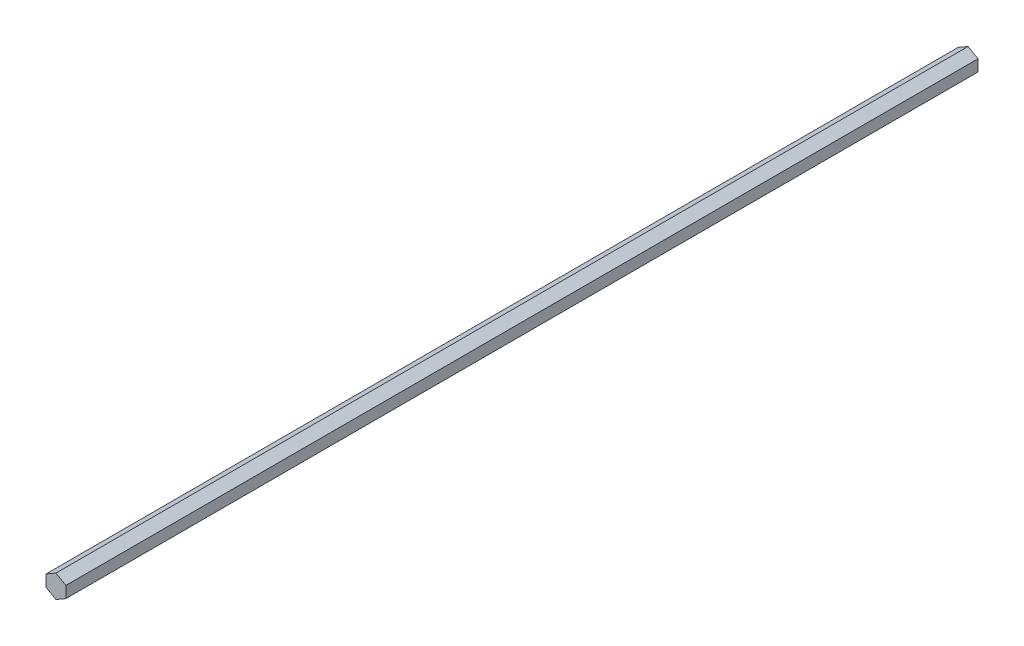
ISO-10303-21;
HEADER;
FILE_DESCRIPTION(('STEP AP214'),'2;1');
FILE_NAME('part.step','',(''),(''),'','','');
FILE_SCHEMA(('AUTOMOTIVE_DESIGN { 1 0 10303 214 1 1 1 1 }'));
ENDSEC;
DATA;
#1=APPLICATION_CONTEXT('core data for automotive mechanical design processes');
#2=APPLICATION_PROTOCOL_DEFINITION('international standard','automotive_design',2000,#1);
#3=PRODUCT_CONTEXT('',#1,'mechanical');
#4=PRODUCT('Part','Part','',(#3));
#5=PRODUCT_RELATED_PRODUCT_CATEGORY('part','',(#4));
#6=PRODUCT_DEFINITION_FORMATION('','',#4);
#7=PRODUCT_DEFINITION_CONTEXT('part definition',#1,'design');
#8=PRODUCT_DEFINITION('design','',#6,#7);
#9=PRODUCT_DEFINITION_SHAPE('','',#8);
#10=(LENGTH_UNIT() NAMED_UNIT(*) SI_UNIT(.MILLI.,.METRE.));
#11=(NAMED_UNIT(*) PLANE_ANGLE_UNIT() SI_UNIT($,.RADIAN.));
#12=(NAMED_UNIT(*) SI_UNIT($,.STERADIAN.) SOLID_ANGLE_UNIT());
#13=UNCERTAINTY_MEASURE_WITH_UNIT(LENGTH_MEASURE(1.E-05),#10,'distance_accuracy_value','');
#14=(GEOMETRIC_REPRESENTATION_CONTEXT(3) GLOBAL_UNCERTAINTY_ASSIGNED_CONTEXT((#13)) GLOBAL_UNIT_ASSIGNED_CONTEXT((#10,
#11,#12)) REPRESENTATION_CONTEXT('',''));
#15=CARTESIAN_POINT('',(0.,0.,0.));
#16=DIRECTION('',(0.,0.,1.));
#17=DIRECTION('',(1.,0.,0.));
#18=AXIS2_PLACEMENT_3D('',#15,#16,#17);
#19=CARTESIAN_POINT('',(6.35,-3.66617420935412,292.1));
#20=DIRECTION('',(-1.,0.,0.));
#21=DIRECTION('',(0.,-1.,0.));
#22=AXIS2_PLACEMENT_3D('',#19,#20,#21);
#23=PLANE('',#22);
#24=DIRECTION('',(0.,1.,0.));
#25=VECTOR('',#24,1.);
#26=CARTESIAN_POINT('',(6.35,-3.66617420935412,-292.1));
#27=LINE('',#26,#25);
#28=CARTESIAN_POINT('',(6.35,-3.66617420935412,-292.1));
#29=VERTEX_POINT('',#28);
#30=CARTESIAN_POINT('',(6.35,3.66617420935412,-292.1));
#31=VERTEX_POINT('',#30);
#32=EDGE_CURVE('E120',#29,#31,#27,.T.);
#33=ORIENTED_EDGE('',*,*,#32,.T.);
#34=DIRECTION('',(0.,0.,-1.));
#35=VECTOR('',#34,1.);
#36=CARTESIAN_POINT('',(6.35,3.66617420935412,292.1));
#37=LINE('',#36,#35);
#38=CARTESIAN_POINT('',(6.35,3.66617420935412,292.1));
#39=VERTEX_POINT('',#38);
#40=EDGE_CURVE('E11',#39,#31,#37,.T.);
#41=ORIENTED_EDGE('',*,*,#40,.F.);
#42=DIRECTION('',(0.,1.,0.));
#43=VECTOR('',#42,1.);
#44=CARTESIAN_POINT('',(6.35,-3.66617420935412,292.1));
#45=LINE('',#44,#43);
#46=CARTESIAN_POINT('',(6.35,-3.66617420935412,292.1));
#47=VERTEX_POINT('',#46);
#48=EDGE_CURVE('E130',#47,#39,#45,.T.);
#49=ORIENTED_EDGE('',*,*,#48,.F.);
#50=DIRECTION('',(0.,0.,-1.));
#51=VECTOR('',#50,1.);
#52=CARTESIAN_POINT('',(6.35,-3.66617420935412,292.1));
#53=LINE('',#52,#51);
#54=EDGE_CURVE('E116',#47,#29,#53,.T.);
#55=ORIENTED_EDGE('',*,*,#54,.T.);
#56=EDGE_LOOP('',(#33,#41,#49,#55));
#57=FACE_BOUND('',#56,.T.);
#58=ADVANCED_FACE('F36',(#57),#23,.F.);
#59=CARTESIAN_POINT('',(6.35,3.66617420935412,292.1));
#60=DIRECTION('',(-0.5,-0.866025403784439,0.));
#61=DIRECTION('',(0.866025403784439,-0.5,0.));
#62=AXIS2_PLACEMENT_3D('',#59,#60,#61);
#63=PLANE('',#62);
#64=DIRECTION('',(-0.866025403784439,0.5,0.));
#65=VECTOR('',#64,1.);
#66=CARTESIAN_POINT('',(6.35,3.66617420935412,-292.1));
#67=LINE('',#66,#65);
#68=CARTESIAN_POINT('',(0.,7.33234841870825,-292.1));
#69=VERTEX_POINT('',#68);
#70=EDGE_CURVE('E123',#31,#69,#67,.T.);
#71=ORIENTED_EDGE('',*,*,#70,.T.);
#72=DIRECTION('',(0.,0.,-1.));
#73=VECTOR('',#72,1.);
#74=CARTESIAN_POINT('',(0.,7.33234841870825,292.1));
#75=LINE('',#74,#73);
#76=CARTESIAN_POINT('',(0.,7.33234841870825,292.1));
#77=VERTEX_POINT('',#76);
#78=EDGE_CURVE('E44',#77,#69,#75,.T.);
#79=ORIENTED_EDGE('',*,*,#78,.F.);
#80=DIRECTION('',(-0.866025403784439,0.5,0.));
#81=VECTOR('',#80,1.);
#82=CARTESIAN_POINT('',(6.35,3.66617420935412,292.1));
#83=LINE('',#82,#81);
#84=EDGE_CURVE('E89',#39,#77,#83,.T.);
#85=ORIENTED_EDGE('',*,*,#84,.F.);
#86=ORIENTED_EDGE('',*,*,#40,.T.);
#87=EDGE_LOOP('',(#71,#79,#85,#86));
#88=FACE_BOUND('',#87,.T.);
#89=ADVANCED_FACE('F154',(#88),#63,.F.);
#90=CARTESIAN_POINT('',(0.,7.33234841870825,292.1));
#91=DIRECTION('',(0.5,-0.866025403784439,0.));
#92=DIRECTION('',(0.866025403784439,0.5,0.));
#93=AXIS2_PLACEMENT_3D('',#90,#91,#92);
#94=PLANE('',#93);
#95=DIRECTION('',(-0.866025403784439,-0.5,0.));
#96=VECTOR('',#95,1.);
#97=CARTESIAN_POINT('',(0.,7.33234841870825,-292.1));
#98=LINE('',#97,#96);
#99=CARTESIAN_POINT('',(-6.35,3.66617420935412,-292.1));
#100=VERTEX_POINT('',#99);
#101=EDGE_CURVE('E125',#69,#100,#98,.T.);
#102=ORIENTED_EDGE('',*,*,#101,.T.);
#103=DIRECTION('',(0.,0.,-1.));
#104=VECTOR('',#103,1.);
#105=CARTESIAN_POINT('',(-6.35,3.66617420935412,292.1));
#106=LINE('',#105,#104);
#107=CARTESIAN_POINT('',(-6.35,3.66617420935412,292.1));
#108=VERTEX_POINT('',#107);
#109=EDGE_CURVE('E111',#108,#100,#106,.T.);
#110=ORIENTED_EDGE('',*,*,#109,.F.);
#111=DIRECTION('',(-0.866025403784439,-0.5,0.));
#112=VECTOR('',#111,1.);
#113=CARTESIAN_POINT('',(0.,7.33234841870825,292.1));
#114=LINE('',#113,#112);
#115=EDGE_CURVE('E102',#77,#108,#114,.T.);
#116=ORIENTED_EDGE('',*,*,#115,.F.);
#117=ORIENTED_EDGE('',*,*,#78,.T.);
#118=EDGE_LOOP('',(#102,#110,#116,#117));
#119=FACE_BOUND('',#118,.T.);
#120=ADVANCED_FACE('F136',(#119),#94,.F.);
#121=CARTESIAN_POINT('',(-6.35,3.66617420935412,292.1));
#122=DIRECTION('',(1.,0.,0.));
#123=DIRECTION('',(0.,1.,0.));
#124=AXIS2_PLACEMENT_3D('',#121,#122,#123);
#125=PLANE('',#124);
#126=DIRECTION('',(0.,-1.,0.));
#127=VECTOR('',#126,1.);
#128=CARTESIAN_POINT('',(-6.35,3.66617420935412,-292.1));
#129=LINE('',#128,#127);
#130=CARTESIAN_POINT('',(-6.35,-3.66617420935412,-292.1));
#131=VERTEX_POINT('',#130);
#132=EDGE_CURVE('E110',#100,#131,#129,.T.);
#133=ORIENTED_EDGE('',*,*,#132,.T.);
#134=DIRECTION('',(0.,0.,-1.));
#135=VECTOR('',#134,1.);
#136=CARTESIAN_POINT('',(-6.35,-3.66617420935412,292.1));
#137=LINE('',#136,#135);
#138=CARTESIAN_POINT('',(-6.35,-3.66617420935412,292.1));
#139=VERTEX_POINT('',#138);
#140=EDGE_CURVE('E107',#139,#131,#137,.T.);
#141=ORIENTED_EDGE('',*,*,#140,.F.);
#142=DIRECTION('',(0.,-1.,0.));
#143=VECTOR('',#142,1.);
#144=CARTESIAN_POINT('',(-6.35,3.66617420935412,292.1));
#145=LINE('',#144,#143);
#146=EDGE_CURVE('E96',#108,#139,#145,.T.);
#147=ORIENTED_EDGE('',*,*,#146,.F.);
#148=ORIENTED_EDGE('',*,*,#109,.T.);
#149=EDGE_LOOP('',(#133,#141,#147,#148));
#150=FACE_BOUND('',#149,.T.);
#151=ADVANCED_FACE('F108',(#150),#125,.F.);
#152=CARTESIAN_POINT('',(-6.35,-3.66617420935412,292.1));
#153=DIRECTION('',(0.5,0.866025403784439,0.));
#154=DIRECTION('',(-0.866025403784439,0.5,0.));
#155=AXIS2_PLACEMENT_3D('',#152,#153,#154);
#156=PLANE('',#155);
#157=DIRECTION('',(0.866025403784439,-0.5,0.));
#158=VECTOR('',#157,1.);
#159=CARTESIAN_POINT('',(-6.35,-3.66617420935412,-292.1));
#160=LINE('',#159,#158);
#161=CARTESIAN_POINT('',(0.,-7.33234841870825,-292.1));
#162=VERTEX_POINT('',#161);
#163=EDGE_CURVE('E75',#131,#162,#160,.T.);
#164=ORIENTED_EDGE('',*,*,#163,.T.);
#165=DIRECTION('',(0.,0.,-1.));
#166=VECTOR('',#165,1.);
#167=CARTESIAN_POINT('',(0.,-7.33234841870825,292.1));
#168=LINE('',#167,#166);
#169=CARTESIAN_POINT('',(0.,-7.33234841870825,292.1));
#170=VERTEX_POINT('',#169);
#171=EDGE_CURVE('E112',#170,#162,#168,.T.);
#172=ORIENTED_EDGE('',*,*,#171,.F.);
#173=DIRECTION('',(0.866025403784439,-0.5,0.));
#174=VECTOR('',#173,1.);
#175=CARTESIAN_POINT('',(-6.35,-3.66617420935412,292.1));
#176=LINE('',#175,#174);
#177=EDGE_CURVE('E100',#139,#170,#176,.T.);
#178=ORIENTED_EDGE('',*,*,#177,.F.);
#179=ORIENTED_EDGE('',*,*,#140,.T.);
#180=EDGE_LOOP('',(#164,#172,#178,#179));
#181=FACE_BOUND('',#180,.T.);
#182=ADVANCED_FACE('F114',(#181),#156,.F.);
#183=CARTESIAN_POINT('',(0.,-7.33234841870825,292.1));
#184=DIRECTION('',(-0.5,0.866025403784439,0.));
#185=DIRECTION('',(-0.866025403784439,-0.5,0.));
#186=AXIS2_PLACEMENT_3D('',#183,#184,#185);
#187=PLANE('',#186);
#188=DIRECTION('',(0.866025403784439,0.5,0.));
#189=VECTOR('',#188,1.);
#190=CARTESIAN_POINT('',(0.,-7.33234841870825,-292.1));
#191=LINE('',#190,#189);
#192=EDGE_CURVE('E81',#162,#29,#191,.T.);
#193=ORIENTED_EDGE('',*,*,#192,.T.);
#194=ORIENTED_EDGE('',*,*,#54,.F.);
#195=DIRECTION('',(0.866025403784439,0.5,0.));
#196=VECTOR('',#195,1.);
#197=CARTESIAN_POINT('',(0.,-7.33234841870825,292.1));
#198=LINE('',#197,#196);
#199=EDGE_CURVE('E52',#170,#47,#198,.T.);
#200=ORIENTED_EDGE('',*,*,#199,.F.);
#201=ORIENTED_EDGE('',*,*,#171,.T.);
#202=EDGE_LOOP('',(#193,#194,#200,#201));
#203=FACE_BOUND('',#202,.T.);
#204=ADVANCED_FACE('F143',(#203),#187,.F.);
#205=CARTESIAN_POINT('',(0.,0.,292.1));
#206=DIRECTION('',(0.,0.,1.));
#207=DIRECTION('',(1.,0.,0.));
#208=AXIS2_PLACEMENT_3D('',#205,#206,#207);
#209=PLANE('',#208);
#210=ORIENTED_EDGE('',*,*,#48,.T.);
#211=ORIENTED_EDGE('',*,*,#84,.T.);
#212=ORIENTED_EDGE('',*,*,#115,.T.);
#213=ORIENTED_EDGE('',*,*,#146,.T.);
#214=ORIENTED_EDGE('',*,*,#177,.T.);
#215=ORIENTED_EDGE('',*,*,#199,.T.);
#216=EDGE_LOOP('',(#210,#211,#212,#213,#214,#215));
#217=FACE_BOUND('',#216,.T.);
#218=ADVANCED_FACE('F98',(#217),#209,.T.);
#219=CARTESIAN_POINT('',(0.,0.,-292.1));
#220=DIRECTION('',(0.,0.,1.));
#221=DIRECTION('',(1.,0.,0.));
#222=AXIS2_PLACEMENT_3D('',#219,#220,#221);
#223=PLANE('',#222);
#224=ORIENTED_EDGE('',*,*,#32,.F.);
#225=ORIENTED_EDGE('',*,*,#192,.F.);
#226=ORIENTED_EDGE('',*,*,#163,.F.);
#227=ORIENTED_EDGE('',*,*,#132,.F.);
#228=ORIENTED_EDGE('',*,*,#101,.F.);
#229=ORIENTED_EDGE('',*,*,#70,.F.);
#230=EDGE_LOOP('',(#224,#225,#226,#227,#228,#229));
#231=FACE_BOUND('',#230,.T.);
#232=ADVANCED_FACE('F139',(#231),#223,.F.);
#233=CLOSED_SHELL('',(#58,#89,#120,#151,#182,#204,#218,#232));
#234=MANIFOLD_SOLID_BREP('B2',#233);
#235=ADVANCED_BREP_SHAPE_REPRESENTATION('',(#18,#234),#14);
#236=SHAPE_DEFINITION_REPRESENTATION(#9,#235);
ENDSEC;
END-ISO-10303-21;
